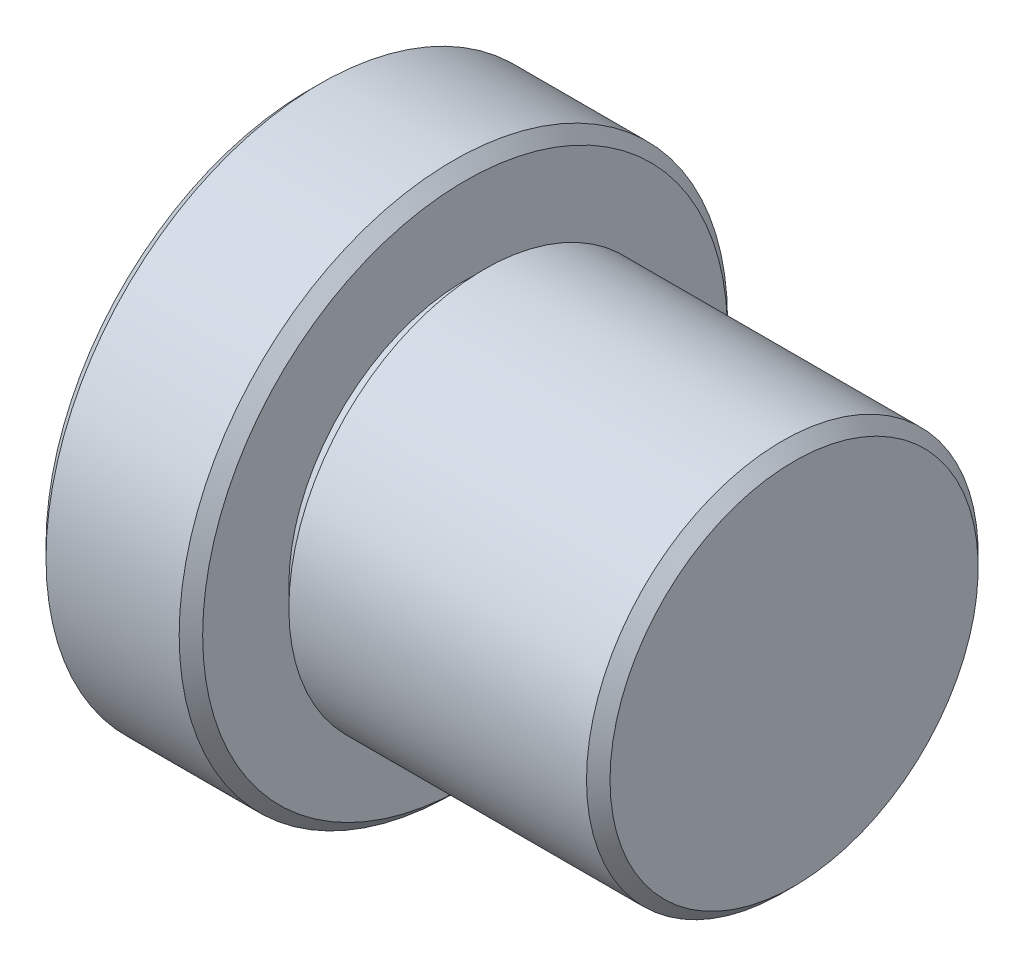
ISO-10303-21;
HEADER;
FILE_DESCRIPTION(('STEP AP214'),'2;1');
FILE_NAME('part.step','',(''),(''),'','','');
FILE_SCHEMA(('AUTOMOTIVE_DESIGN { 1 0 10303 214 1 1 1 1 }'));
ENDSEC;
DATA;
#1=APPLICATION_CONTEXT('core data for automotive mechanical design processes');
#2=APPLICATION_PROTOCOL_DEFINITION('international standard','automotive_design',2000,#1);
#3=PRODUCT_CONTEXT('',#1,'mechanical');
#4=PRODUCT('Part','Part','',(#3));
#5=PRODUCT_RELATED_PRODUCT_CATEGORY('part','',(#4));
#6=PRODUCT_DEFINITION_FORMATION('','',#4);
#7=PRODUCT_DEFINITION_CONTEXT('part definition',#1,'design');
#8=PRODUCT_DEFINITION('design','',#6,#7);
#9=PRODUCT_DEFINITION_SHAPE('','',#8);
#10=(LENGTH_UNIT() NAMED_UNIT(*) SI_UNIT(.MILLI.,.METRE.));
#11=(NAMED_UNIT(*) PLANE_ANGLE_UNIT() SI_UNIT($,.RADIAN.));
#12=(NAMED_UNIT(*) SI_UNIT($,.STERADIAN.) SOLID_ANGLE_UNIT());
#13=UNCERTAINTY_MEASURE_WITH_UNIT(LENGTH_MEASURE(1.E-05),#10,'distance_accuracy_value','');
#14=(GEOMETRIC_REPRESENTATION_CONTEXT(3) GLOBAL_UNCERTAINTY_ASSIGNED_CONTEXT((#13)) GLOBAL_UNIT_ASSIGNED_CONTEXT((#10,
#11,#12)) REPRESENTATION_CONTEXT('',''));
#15=CARTESIAN_POINT('',(0.,0.,0.));
#16=DIRECTION('',(0.,0.,1.));
#17=DIRECTION('',(1.,0.,0.));
#18=AXIS2_PLACEMENT_3D('',#15,#16,#17);
#19=CARTESIAN_POINT('',(0.,0.,0.));
#20=DIRECTION('',(1.,0.,0.));
#21=DIRECTION('',(0.,0.,-1.));
#22=AXIS2_PLACEMENT_3D('',#19,#20,#21);
#23=PLANE('',#22);
#24=DIRECTION('',(0.,-0.866025403784439,0.5));
#25=VECTOR('',#24,1.);
#26=CARTESIAN_POINT('',(0.,-2.5,-1.44337567297406));
#27=LINE('',#26,#25);
#28=CARTESIAN_POINT('',(0.,0.,-2.88675134594813));
#29=VERTEX_POINT('',#28);
#30=CARTESIAN_POINT('',(0.,-2.5,-1.44337567297406));
#31=VERTEX_POINT('',#30);
#32=EDGE_CURVE('E100',#29,#31,#27,.T.);
#33=ORIENTED_EDGE('',*,*,#32,.F.);
#34=DIRECTION('',(0.,-0.866025403784439,-0.5));
#35=VECTOR('',#34,1.);
#36=CARTESIAN_POINT('',(0.,0.,-2.88675134594813));
#37=LINE('',#36,#35);
#38=CARTESIAN_POINT('',(0.,2.5,-1.44337567297406));
#39=VERTEX_POINT('',#38);
#40=EDGE_CURVE('E46',#39,#29,#37,.T.);
#41=ORIENTED_EDGE('',*,*,#40,.F.);
#42=DIRECTION('',(0.,0.,-1.));
#43=VECTOR('',#42,1.);
#44=CARTESIAN_POINT('',(0.,2.5,-1.44337567297406));
#45=LINE('',#44,#43);
#46=CARTESIAN_POINT('',(0.,2.5,1.44337567297406));
#47=VERTEX_POINT('',#46);
#48=EDGE_CURVE('E115',#47,#39,#45,.T.);
#49=ORIENTED_EDGE('',*,*,#48,.F.);
#50=DIRECTION('',(0.,0.866025403784439,-0.5));
#51=VECTOR('',#50,1.);
#52=CARTESIAN_POINT('',(0.,2.5,1.44337567297406));
#53=LINE('',#52,#51);
#54=CARTESIAN_POINT('',(0.,0.,2.88675134594813));
#55=VERTEX_POINT('',#54);
#56=EDGE_CURVE('E109',#55,#47,#53,.T.);
#57=ORIENTED_EDGE('',*,*,#56,.F.);
#58=DIRECTION('',(0.,0.866025403784439,0.5));
#59=VECTOR('',#58,1.);
#60=CARTESIAN_POINT('',(0.,0.,2.88675134594813));
#61=LINE('',#60,#59);
#62=CARTESIAN_POINT('',(0.,-2.5,1.44337567297406));
#63=VERTEX_POINT('',#62);
#64=EDGE_CURVE('E107',#63,#55,#61,.T.);
#65=ORIENTED_EDGE('',*,*,#64,.F.);
#66=DIRECTION('',(0.,0.,1.));
#67=VECTOR('',#66,1.);
#68=CARTESIAN_POINT('',(0.,-2.5,1.44337567297406));
#69=LINE('',#68,#67);
#70=EDGE_CURVE('E89',#31,#63,#69,.T.);
#71=ORIENTED_EDGE('',*,*,#70,.F.);
#72=EDGE_LOOP('',(#33,#41,#49,#57,#65,#71));
#73=FACE_BOUND('',#72,.T.);
#74=CARTESIAN_POINT('',(0.,0.,0.));
#75=DIRECTION('',(-1.,0.,0.));
#76=DIRECTION('',(0.,0.,1.));
#77=AXIS2_PLACEMENT_3D('',#74,#75,#76);
#78=CIRCLE('',#77,6.7);
#79=CARTESIAN_POINT('',(0.,0.,6.7));
#80=VERTEX_POINT('',#79);
#81=EDGE_CURVE('E11',#80,#80,#78,.T.);
#82=ORIENTED_EDGE('',*,*,#81,.T.);
#83=EDGE_LOOP('',(#82));
#84=FACE_BOUND('',#83,.T.);
#85=ADVANCED_FACE('F32',(#73,#84),#23,.F.);
#86=CARTESIAN_POINT('',(0.3,0.,0.));
#87=DIRECTION('',(1.,0.,0.));
#88=DIRECTION('',(0.,0.,-1.));
#89=AXIS2_PLACEMENT_3D('',#86,#87,#88);
#90=CONICAL_SURFACE('',#89,7.,0.785398163397448);
#91=ORIENTED_EDGE('',*,*,#81,.F.);
#92=EDGE_LOOP('',(#91));
#93=FACE_BOUND('',#92,.T.);
#94=CARTESIAN_POINT('',(0.3,0.,0.));
#95=DIRECTION('',(-1.,0.,0.));
#96=DIRECTION('',(0.,0.,1.));
#97=AXIS2_PLACEMENT_3D('',#94,#95,#96);
#98=CIRCLE('',#97,7.);
#99=CARTESIAN_POINT('',(0.3,0.,7.));
#100=VERTEX_POINT('',#99);
#101=EDGE_CURVE('E39',#100,#100,#98,.T.);
#102=ORIENTED_EDGE('',*,*,#101,.T.);
#103=EDGE_LOOP('',(#102));
#104=FACE_BOUND('',#103,.T.);
#105=ADVANCED_FACE('F162',(#93,#104),#90,.T.);
#106=CARTESIAN_POINT('',(-14.2067796610169,0.,0.));
#107=DIRECTION('',(-1.,0.,0.));
#108=DIRECTION('',(0.,0.,1.));
#109=AXIS2_PLACEMENT_3D('',#106,#107,#108);
#110=CYLINDRICAL_SURFACE('',#109,7.);
#111=ORIENTED_EDGE('',*,*,#101,.F.);
#112=EDGE_LOOP('',(#111));
#113=FACE_BOUND('',#112,.T.);
#114=CARTESIAN_POINT('',(3.7,0.,0.));
#115=DIRECTION('',(-1.,0.,0.));
#116=DIRECTION('',(0.,0.,1.));
#117=AXIS2_PLACEMENT_3D('',#114,#115,#116);
#118=CIRCLE('',#117,7.);
#119=CARTESIAN_POINT('',(3.7,0.,7.));
#120=VERTEX_POINT('',#119);
#121=EDGE_CURVE('E157',#120,#120,#118,.T.);
#122=ORIENTED_EDGE('',*,*,#121,.T.);
#123=EDGE_LOOP('',(#122));
#124=FACE_BOUND('',#123,.T.);
#125=ADVANCED_FACE('F164',(#113,#124),#110,.T.);
#126=CARTESIAN_POINT('',(4.,0.,0.));
#127=DIRECTION('',(-1.,0.,0.));
#128=DIRECTION('',(0.,0.,1.));
#129=AXIS2_PLACEMENT_3D('',#126,#127,#128);
#130=CONICAL_SURFACE('',#129,6.7,0.785398163397451);
#131=ORIENTED_EDGE('',*,*,#121,.F.);
#132=EDGE_LOOP('',(#131));
#133=FACE_BOUND('',#132,.T.);
#134=CARTESIAN_POINT('',(4.,0.,0.));
#135=DIRECTION('',(-1.,0.,0.));
#136=DIRECTION('',(0.,0.,1.));
#137=AXIS2_PLACEMENT_3D('',#134,#135,#136);
#138=CIRCLE('',#137,6.7);
#139=CARTESIAN_POINT('',(4.,0.,6.7));
#140=VERTEX_POINT('',#139);
#141=EDGE_CURVE('E154',#140,#140,#138,.T.);
#142=ORIENTED_EDGE('',*,*,#141,.T.);
#143=EDGE_LOOP('',(#142));
#144=FACE_BOUND('',#143,.T.);
#145=ADVANCED_FACE('F167',(#133,#144),#130,.T.);
#146=CARTESIAN_POINT('',(4.,6.7,0.));
#147=DIRECTION('',(-1.,0.,0.));
#148=DIRECTION('',(0.,0.,1.));
#149=AXIS2_PLACEMENT_3D('',#146,#147,#148);
#150=PLANE('',#149);
#151=ORIENTED_EDGE('',*,*,#141,.F.);
#152=EDGE_LOOP('',(#151));
#153=FACE_BOUND('',#152,.T.);
#154=CARTESIAN_POINT('',(4.,0.,0.));
#155=DIRECTION('',(-1.,0.,0.));
#156=DIRECTION('',(0.,0.,1.));
#157=AXIS2_PLACEMENT_3D('',#154,#155,#156);
#158=CIRCLE('',#157,4.5);
#159=CARTESIAN_POINT('',(4.,0.,4.5));
#160=VERTEX_POINT('',#159);
#161=EDGE_CURVE('E151',#160,#160,#158,.T.);
#162=ORIENTED_EDGE('',*,*,#161,.T.);
#163=EDGE_LOOP('',(#162));
#164=FACE_BOUND('',#163,.T.);
#165=ADVANCED_FACE('F173',(#153,#164),#150,.F.);
#166=CARTESIAN_POINT('',(-14.2067796610169,0.,0.));
#167=DIRECTION('',(-1.,0.,0.));
#168=DIRECTION('',(0.,0.,1.));
#169=AXIS2_PLACEMENT_3D('',#166,#167,#168);
#170=CYLINDRICAL_SURFACE('',#169,4.5);
#171=ORIENTED_EDGE('',*,*,#161,.F.);
#172=EDGE_LOOP('',(#171));
#173=FACE_BOUND('',#172,.T.);
#174=CARTESIAN_POINT('',(4.5,0.,0.));
#175=DIRECTION('',(-1.,0.,0.));
#176=DIRECTION('',(0.,0.,1.));
#177=AXIS2_PLACEMENT_3D('',#174,#175,#176);
#178=CIRCLE('',#177,4.5);
#179=CARTESIAN_POINT('',(4.5,0.,4.5));
#180=VERTEX_POINT('',#179);
#181=EDGE_CURVE('E148',#180,#180,#178,.T.);
#182=ORIENTED_EDGE('',*,*,#181,.T.);
#183=EDGE_LOOP('',(#182));
#184=FACE_BOUND('',#183,.T.);
#185=ADVANCED_FACE('F179',(#173,#184),#170,.T.);
#186=CARTESIAN_POINT('',(4.5,4.5,0.));
#187=DIRECTION('',(1.,0.,0.));
#188=DIRECTION('',(0.,0.,-1.));
#189=AXIS2_PLACEMENT_3D('',#186,#187,#188);
#190=PLANE('',#189);
#191=ORIENTED_EDGE('',*,*,#181,.F.);
#192=EDGE_LOOP('',(#191));
#193=FACE_BOUND('',#192,.T.);
#194=CARTESIAN_POINT('',(4.5,0.,0.));
#195=DIRECTION('',(-1.,0.,0.));
#196=DIRECTION('',(0.,0.,1.));
#197=AXIS2_PLACEMENT_3D('',#194,#195,#196);
#198=CIRCLE('',#197,5.);
#199=CARTESIAN_POINT('',(4.5,0.,5.));
#200=VERTEX_POINT('',#199);
#201=EDGE_CURVE('E145',#200,#200,#198,.T.);
#202=ORIENTED_EDGE('',*,*,#201,.T.);
#203=EDGE_LOOP('',(#202));
#204=FACE_BOUND('',#203,.T.);
#205=ADVANCED_FACE('F185',(#193,#204),#190,.F.);
#206=CARTESIAN_POINT('',(-14.2067796610169,0.,0.));
#207=DIRECTION('',(-1.,0.,0.));
#208=DIRECTION('',(0.,0.,1.));
#209=AXIS2_PLACEMENT_3D('',#206,#207,#208);
#210=CYLINDRICAL_SURFACE('',#209,5.);
#211=ORIENTED_EDGE('',*,*,#201,.F.);
#212=EDGE_LOOP('',(#211));
#213=FACE_BOUND('',#212,.T.);
#214=CARTESIAN_POINT('',(12.1,0.,0.));
#215=DIRECTION('',(-1.,0.,0.));
#216=DIRECTION('',(0.,0.,1.));
#217=AXIS2_PLACEMENT_3D('',#214,#215,#216);
#218=CIRCLE('',#217,5.);
#219=CARTESIAN_POINT('',(12.1,0.,5.));
#220=VERTEX_POINT('',#219);
#221=EDGE_CURVE('E142',#220,#220,#218,.T.);
#222=ORIENTED_EDGE('',*,*,#221,.T.);
#223=EDGE_LOOP('',(#222));
#224=FACE_BOUND('',#223,.T.);
#225=ADVANCED_FACE('F191',(#213,#224),#210,.T.);
#226=CARTESIAN_POINT('',(12.4,0.,0.));
#227=DIRECTION('',(-1.,0.,0.));
#228=DIRECTION('',(0.,0.,1.));
#229=AXIS2_PLACEMENT_3D('',#226,#227,#228);
#230=CONICAL_SURFACE('',#229,4.7,0.785398163397445);
#231=ORIENTED_EDGE('',*,*,#221,.F.);
#232=EDGE_LOOP('',(#231));
#233=FACE_BOUND('',#232,.T.);
#234=CARTESIAN_POINT('',(12.4,0.,0.));
#235=DIRECTION('',(-1.,0.,0.));
#236=DIRECTION('',(0.,0.,1.));
#237=AXIS2_PLACEMENT_3D('',#234,#235,#236);
#238=CIRCLE('',#237,4.7);
#239=CARTESIAN_POINT('',(12.4,0.,4.7));
#240=VERTEX_POINT('',#239);
#241=EDGE_CURVE('E133',#240,#240,#238,.T.);
#242=ORIENTED_EDGE('',*,*,#241,.T.);
#243=EDGE_LOOP('',(#242));
#244=FACE_BOUND('',#243,.T.);
#245=ADVANCED_FACE('F197',(#233,#244),#230,.T.);
#246=CARTESIAN_POINT('',(12.4,4.7,0.));
#247=DIRECTION('',(-1.,0.,0.));
#248=DIRECTION('',(0.,0.,1.));
#249=AXIS2_PLACEMENT_3D('',#246,#247,#248);
#250=PLANE('',#249);
#251=ORIENTED_EDGE('',*,*,#241,.F.);
#252=EDGE_LOOP('',(#251));
#253=FACE_BOUND('',#252,.T.);
#254=ADVANCED_FACE('F203',(#253),#250,.F.);
#255=CARTESIAN_POINT('',(8.,0.,-2.88675134594813));
#256=DIRECTION('',(0.,0.5,-0.866025403784439));
#257=DIRECTION('',(0.,0.866025403784439,0.5));
#258=AXIS2_PLACEMENT_3D('',#255,#256,#257);
#259=PLANE('',#258);
#260=ORIENTED_EDGE('',*,*,#40,.T.);
#261=DIRECTION('',(-1.,0.,0.));
#262=VECTOR('',#261,1.);
#263=CARTESIAN_POINT('',(8.,0.,-2.88675134594813));
#264=LINE('',#263,#262);
#265=CARTESIAN_POINT('',(8.,0.,-2.88675134594813));
#266=VERTEX_POINT('',#265);
#267=EDGE_CURVE('E97',#266,#29,#264,.T.);
#268=ORIENTED_EDGE('',*,*,#267,.F.);
#269=DIRECTION('',(0.,-0.866025403784439,-0.5));
#270=VECTOR('',#269,1.);
#271=CARTESIAN_POINT('',(8.,0.,-2.88675134594813));
#272=LINE('',#271,#270);
#273=CARTESIAN_POINT('',(8.,2.5,-1.44337567297406));
#274=VERTEX_POINT('',#273);
#275=EDGE_CURVE('E117',#274,#266,#272,.T.);
#276=ORIENTED_EDGE('',*,*,#275,.F.);
#277=DIRECTION('',(-1.,0.,0.));
#278=VECTOR('',#277,1.);
#279=CARTESIAN_POINT('',(8.,2.5,-1.44337567297406));
#280=LINE('',#279,#278);
#281=EDGE_CURVE('E53',#274,#39,#280,.T.);
#282=ORIENTED_EDGE('',*,*,#281,.T.);
#283=EDGE_LOOP('',(#260,#268,#276,#282));
#284=FACE_BOUND('',#283,.T.);
#285=ADVANCED_FACE('F208',(#284),#259,.F.);
#286=CARTESIAN_POINT('',(8.,2.5,-1.44337567297406));
#287=DIRECTION('',(0.,1.,0.));
#288=DIRECTION('',(0.,0.,1.));
#289=AXIS2_PLACEMENT_3D('',#286,#287,#288);
#290=PLANE('',#289);
#291=ORIENTED_EDGE('',*,*,#48,.T.);
#292=ORIENTED_EDGE('',*,*,#281,.F.);
#293=DIRECTION('',(0.,0.,-1.));
#294=VECTOR('',#293,1.);
#295=CARTESIAN_POINT('',(8.,2.5,-1.44337567297406));
#296=LINE('',#295,#294);
#297=CARTESIAN_POINT('',(8.,2.5,1.44337567297406));
#298=VERTEX_POINT('',#297);
#299=EDGE_CURVE('E129',#298,#274,#296,.T.);
#300=ORIENTED_EDGE('',*,*,#299,.F.);
#301=DIRECTION('',(-1.,0.,0.));
#302=VECTOR('',#301,1.);
#303=CARTESIAN_POINT('',(8.,2.5,1.44337567297406));
#304=LINE('',#303,#302);
#305=EDGE_CURVE('E134',#298,#47,#304,.T.);
#306=ORIENTED_EDGE('',*,*,#305,.T.);
#307=EDGE_LOOP('',(#291,#292,#300,#306));
#308=FACE_BOUND('',#307,.T.);
#309=ADVANCED_FACE('F213',(#308),#290,.F.);
#310=CARTESIAN_POINT('',(8.,2.5,1.44337567297406));
#311=DIRECTION('',(0.,0.5,0.866025403784439));
#312=DIRECTION('',(0.,-0.866025403784439,0.5));
#313=AXIS2_PLACEMENT_3D('',#310,#311,#312);
#314=PLANE('',#313);
#315=ORIENTED_EDGE('',*,*,#56,.T.);
#316=ORIENTED_EDGE('',*,*,#305,.F.);
#317=DIRECTION('',(0.,0.866025403784439,-0.5));
#318=VECTOR('',#317,1.);
#319=CARTESIAN_POINT('',(8.,2.5,1.44337567297406));
#320=LINE('',#319,#318);
#321=CARTESIAN_POINT('',(8.,0.,2.88675134594813));
#322=VERTEX_POINT('',#321);
#323=EDGE_CURVE('E126',#322,#298,#320,.T.);
#324=ORIENTED_EDGE('',*,*,#323,.F.);
#325=DIRECTION('',(-1.,0.,0.));
#326=VECTOR('',#325,1.);
#327=CARTESIAN_POINT('',(8.,0.,2.88675134594813));
#328=LINE('',#327,#326);
#329=EDGE_CURVE('E136',#322,#55,#328,.T.);
#330=ORIENTED_EDGE('',*,*,#329,.T.);
#331=EDGE_LOOP('',(#315,#316,#324,#330));
#332=FACE_BOUND('',#331,.T.);
#333=ADVANCED_FACE('F274',(#332),#314,.F.);
#334=CARTESIAN_POINT('',(8.,0.,2.88675134594813));
#335=DIRECTION('',(0.,-0.5,0.866025403784439));
#336=DIRECTION('',(0.,-0.866025403784439,-0.5));
#337=AXIS2_PLACEMENT_3D('',#334,#335,#336);
#338=PLANE('',#337);
#339=ORIENTED_EDGE('',*,*,#64,.T.);
#340=ORIENTED_EDGE('',*,*,#329,.F.);
#341=DIRECTION('',(0.,0.866025403784439,0.5));
#342=VECTOR('',#341,1.);
#343=CARTESIAN_POINT('',(8.,0.,2.88675134594813));
#344=LINE('',#343,#342);
#345=CARTESIAN_POINT('',(8.,-2.5,1.44337567297406));
#346=VERTEX_POINT('',#345);
#347=EDGE_CURVE('E123',#346,#322,#344,.T.);
#348=ORIENTED_EDGE('',*,*,#347,.F.);
#349=DIRECTION('',(-1.,0.,0.));
#350=VECTOR('',#349,1.);
#351=CARTESIAN_POINT('',(8.,-2.5,1.44337567297406));
#352=LINE('',#351,#350);
#353=EDGE_CURVE('E96',#346,#63,#352,.T.);
#354=ORIENTED_EDGE('',*,*,#353,.T.);
#355=EDGE_LOOP('',(#339,#340,#348,#354));
#356=FACE_BOUND('',#355,.T.);
#357=ADVANCED_FACE('F283',(#356),#338,.F.);
#358=CARTESIAN_POINT('',(8.,-2.5,1.44337567297406));
#359=DIRECTION('',(0.,-1.,0.));
#360=DIRECTION('',(0.,0.,-1.));
#361=AXIS2_PLACEMENT_3D('',#358,#359,#360);
#362=PLANE('',#361);
#363=ORIENTED_EDGE('',*,*,#70,.T.);
#364=ORIENTED_EDGE('',*,*,#353,.F.);
#365=DIRECTION('',(0.,0.,1.));
#366=VECTOR('',#365,1.);
#367=CARTESIAN_POINT('',(8.,-2.5,1.44337567297406));
#368=LINE('',#367,#366);
#369=CARTESIAN_POINT('',(8.,-2.5,-1.44337567297406));
#370=VERTEX_POINT('',#369);
#371=EDGE_CURVE('E92',#370,#346,#368,.T.);
#372=ORIENTED_EDGE('',*,*,#371,.F.);
#373=DIRECTION('',(-1.,0.,0.));
#374=VECTOR('',#373,1.);
#375=CARTESIAN_POINT('',(8.,-2.5,-1.44337567297406));
#376=LINE('',#375,#374);
#377=EDGE_CURVE('E85',#370,#31,#376,.T.);
#378=ORIENTED_EDGE('',*,*,#377,.T.);
#379=EDGE_LOOP('',(#363,#364,#372,#378));
#380=FACE_BOUND('',#379,.T.);
#381=ADVANCED_FACE('F87',(#380),#362,.F.);
#382=CARTESIAN_POINT('',(8.,-2.5,-1.44337567297406));
#383=DIRECTION('',(0.,-0.5,-0.866025403784439));
#384=DIRECTION('',(0.,0.866025403784439,-0.5));
#385=AXIS2_PLACEMENT_3D('',#382,#383,#384);
#386=PLANE('',#385);
#387=ORIENTED_EDGE('',*,*,#32,.T.);
#388=ORIENTED_EDGE('',*,*,#377,.F.);
#389=DIRECTION('',(0.,-0.866025403784439,0.5));
#390=VECTOR('',#389,1.);
#391=CARTESIAN_POINT('',(8.,-2.5,-1.44337567297406));
#392=LINE('',#391,#390);
#393=EDGE_CURVE('E120',#266,#370,#392,.T.);
#394=ORIENTED_EDGE('',*,*,#393,.F.);
#395=ORIENTED_EDGE('',*,*,#267,.T.);
#396=EDGE_LOOP('',(#387,#388,#394,#395));
#397=FACE_BOUND('',#396,.T.);
#398=ADVANCED_FACE('F101',(#397),#386,.F.);
#399=CARTESIAN_POINT('',(8.,2.5,-1.44337567297407));
#400=DIRECTION('',(1.,0.,0.));
#401=DIRECTION('',(0.,0.,-1.));
#402=AXIS2_PLACEMENT_3D('',#399,#400,#401);
#403=PLANE('',#402);
#404=ORIENTED_EDGE('',*,*,#275,.T.);
#405=ORIENTED_EDGE('',*,*,#393,.T.);
#406=ORIENTED_EDGE('',*,*,#371,.T.);
#407=ORIENTED_EDGE('',*,*,#347,.T.);
#408=ORIENTED_EDGE('',*,*,#323,.T.);
#409=ORIENTED_EDGE('',*,*,#299,.T.);
#410=EDGE_LOOP('',(#404,#405,#406,#407,#408,#409));
#411=FACE_BOUND('',#410,.T.);
#412=ADVANCED_FACE('F310',(#411),#403,.F.);
#413=CLOSED_SHELL('',(#85,#105,#125,#145,#165,#185,#205,#225,#245,#254,#285,#309,#333,#357,#381,
#398,#412));
#414=MANIFOLD_SOLID_BREP('B2',#413);
#415=ADVANCED_BREP_SHAPE_REPRESENTATION('',(#18,#414),#14);
#416=SHAPE_DEFINITION_REPRESENTATION(#9,#415);
ENDSEC;
END-ISO-10303-21;
